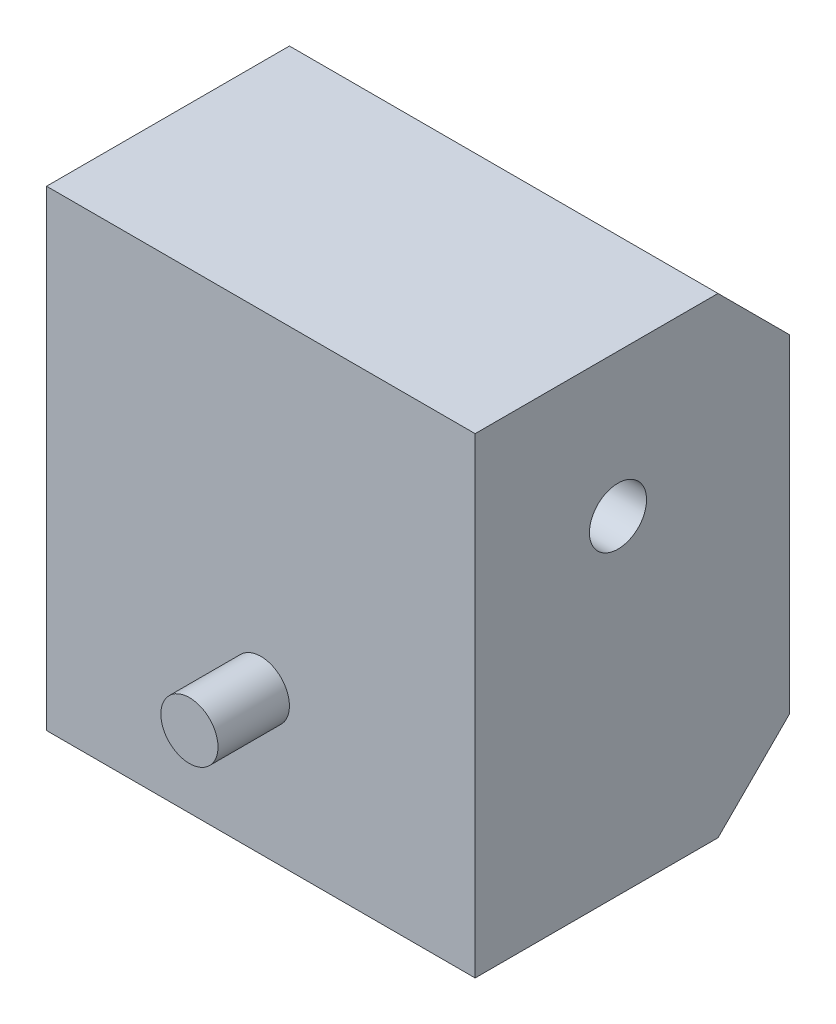
ISO-10303-21;
HEADER;
FILE_DESCRIPTION(('STEP AP214'),'2;1');
FILE_NAME('part.step','',(''),(''),'','','');
FILE_SCHEMA(('AUTOMOTIVE_DESIGN { 1 0 10303 214 1 1 1 1 }'));
ENDSEC;
DATA;
#1=APPLICATION_CONTEXT('core data for automotive mechanical design processes');
#2=APPLICATION_PROTOCOL_DEFINITION('international standard','automotive_design',2000,#1);
#3=PRODUCT_CONTEXT('',#1,'mechanical');
#4=PRODUCT('Part','Part','',(#3));
#5=PRODUCT_RELATED_PRODUCT_CATEGORY('part','',(#4));
#6=PRODUCT_DEFINITION_FORMATION('','',#4);
#7=PRODUCT_DEFINITION_CONTEXT('part definition',#1,'design');
#8=PRODUCT_DEFINITION('design','',#6,#7);
#9=PRODUCT_DEFINITION_SHAPE('','',#8);
#10=(LENGTH_UNIT() NAMED_UNIT(*) SI_UNIT(.MILLI.,.METRE.));
#11=(NAMED_UNIT(*) PLANE_ANGLE_UNIT() SI_UNIT($,.RADIAN.));
#12=(NAMED_UNIT(*) SI_UNIT($,.STERADIAN.) SOLID_ANGLE_UNIT());
#13=UNCERTAINTY_MEASURE_WITH_UNIT(LENGTH_MEASURE(1.E-05),#10,'distance_accuracy_value','');
#14=(GEOMETRIC_REPRESENTATION_CONTEXT(3) GLOBAL_UNCERTAINTY_ASSIGNED_CONTEXT((#13)) GLOBAL_UNIT_ASSIGNED_CONTEXT((#10,
#11,#12)) REPRESENTATION_CONTEXT('',''));
#15=CARTESIAN_POINT('',(0.,0.,0.));
#16=DIRECTION('',(0.,0.,1.));
#17=DIRECTION('',(1.,0.,0.));
#18=AXIS2_PLACEMENT_3D('',#15,#16,#17);
#19=CARTESIAN_POINT('',(-15.1660516605166,12.0664206642066,22.));
#20=DIRECTION('',(1.,0.,0.));
#21=DIRECTION('',(0.,1.,0.));
#22=AXIS2_PLACEMENT_3D('',#19,#20,#21);
#23=PLANE('',#22);
#24=CARTESIAN_POINT('',(-15.1660516605166,2.06642066420664,12.));
#25=DIRECTION('',(1.,0.,0.));
#26=DIRECTION('',(0.,1.,0.));
#27=AXIS2_PLACEMENT_3D('',#24,#25,#26);
#28=CIRCLE('',#27,2.);
#29=CARTESIAN_POINT('',(-15.1660516605166,4.06642066420664,12.));
#30=VERTEX_POINT('',#29);
#31=EDGE_CURVE('E138',#30,#30,#28,.T.);
#32=ORIENTED_EDGE('',*,*,#31,.T.);
#33=EDGE_LOOP('',(#32));
#34=FACE_BOUND('',#33,.T.);
#35=DIRECTION('',(0.,-1.,0.));
#36=VECTOR('',#35,1.);
#37=CARTESIAN_POINT('',(-15.1660516605166,12.0664206642066,0.));
#38=LINE('',#37,#36);
#39=CARTESIAN_POINT('',(-15.1660516605166,7.06642066420662,0.));
#40=VERTEX_POINT('',#39);
#41=CARTESIAN_POINT('',(-15.1660516605166,-15.9335793357933,0.));
#42=VERTEX_POINT('',#41);
#43=EDGE_CURVE('E136',#40,#42,#38,.T.);
#44=ORIENTED_EDGE('',*,*,#43,.T.);
#45=DIRECTION('',(0.,0.707106781186549,-0.707106781186546));
#46=VECTOR('',#45,1.);
#47=CARTESIAN_POINT('',(-15.1660516605166,-20.9335793357934,5.));
#48=LINE('',#47,#46);
#49=CARTESIAN_POINT('',(-15.1660516605166,-20.9335793357934,5.));
#50=VERTEX_POINT('',#49);
#51=EDGE_CURVE('E11',#42,#50,#48,.F.);
#52=ORIENTED_EDGE('',*,*,#51,.T.);
#53=DIRECTION('',(0.,0.,-1.));
#54=VECTOR('',#53,1.);
#55=CARTESIAN_POINT('',(-15.1660516605166,-20.9335793357934,22.));
#56=LINE('',#55,#54);
#57=CARTESIAN_POINT('',(-15.1660516605166,-20.9335793357934,22.));
#58=VERTEX_POINT('',#57);
#59=EDGE_CURVE('E93',#58,#50,#56,.T.);
#60=ORIENTED_EDGE('',*,*,#59,.F.);
#61=DIRECTION('',(0.,-1.,0.));
#62=VECTOR('',#61,1.);
#63=CARTESIAN_POINT('',(-15.1660516605166,12.0664206642066,22.));
#64=LINE('',#63,#62);
#65=CARTESIAN_POINT('',(-15.1660516605166,12.0664206642066,22.));
#66=VERTEX_POINT('',#65);
#67=EDGE_CURVE('E99',#66,#58,#64,.T.);
#68=ORIENTED_EDGE('',*,*,#67,.F.);
#69=DIRECTION('',(0.,0.,-1.));
#70=VECTOR('',#69,1.);
#71=CARTESIAN_POINT('',(-15.1660516605166,12.0664206642066,22.));
#72=LINE('',#71,#70);
#73=CARTESIAN_POINT('',(-15.1660516605166,12.0664206642066,5.));
#74=VERTEX_POINT('',#73);
#75=EDGE_CURVE('E133',#66,#74,#72,.T.);
#76=ORIENTED_EDGE('',*,*,#75,.T.);
#77=DIRECTION('',(0.,0.707106781186549,0.707106781186546));
#78=VECTOR('',#77,1.);
#79=CARTESIAN_POINT('',(-15.1660516605166,12.0664206642066,5.));
#80=LINE('',#79,#78);
#81=EDGE_CURVE('E114',#74,#40,#80,.F.);
#82=ORIENTED_EDGE('',*,*,#81,.T.);
#83=EDGE_LOOP('',(#44,#52,#60,#68,#76,#82));
#84=FACE_BOUND('',#83,.T.);
#85=ADVANCED_FACE('F35',(#34,#84),#23,.F.);
#86=CARTESIAN_POINT('',(-15.1660516605166,-20.9335793357934,22.));
#87=DIRECTION('',(0.,1.,0.));
#88=DIRECTION('',(0.,0.,1.));
#89=AXIS2_PLACEMENT_3D('',#86,#87,#88);
#90=PLANE('',#89);
#91=ORIENTED_EDGE('',*,*,#59,.T.);
#92=DIRECTION('',(1.,0.,0.));
#93=VECTOR('',#92,1.);
#94=CARTESIAN_POINT('',(-15.1660516605166,-20.9335793357934,5.));
#95=LINE('',#94,#93);
#96=CARTESIAN_POINT('',(14.8339483394834,-20.9335793357934,5.));
#97=VERTEX_POINT('',#96);
#98=EDGE_CURVE('E126',#50,#97,#95,.T.);
#99=ORIENTED_EDGE('',*,*,#98,.T.);
#100=DIRECTION('',(0.,0.,-1.));
#101=VECTOR('',#100,1.);
#102=CARTESIAN_POINT('',(14.8339483394834,-20.9335793357934,22.));
#103=LINE('',#102,#101);
#104=CARTESIAN_POINT('',(14.8339483394834,-20.9335793357934,22.));
#105=VERTEX_POINT('',#104);
#106=EDGE_CURVE('E95',#105,#97,#103,.T.);
#107=ORIENTED_EDGE('',*,*,#106,.F.);
#108=DIRECTION('',(1.,0.,0.));
#109=VECTOR('',#108,1.);
#110=CARTESIAN_POINT('',(-15.1660516605166,-20.9335793357934,22.));
#111=LINE('',#110,#109);
#112=EDGE_CURVE('E88',#58,#105,#111,.T.);
#113=ORIENTED_EDGE('',*,*,#112,.F.);
#114=EDGE_LOOP('',(#91,#99,#107,#113));
#115=FACE_BOUND('',#114,.T.);
#116=ADVANCED_FACE('F90',(#115),#90,.F.);
#117=CARTESIAN_POINT('',(14.8339483394834,12.0664206642066,22.));
#118=DIRECTION('',(-1.,0.,0.));
#119=DIRECTION('',(0.,-1.,0.));
#120=AXIS2_PLACEMENT_3D('',#117,#118,#119);
#121=PLANE('',#120);
#122=CARTESIAN_POINT('',(14.8339483394834,2.06642066420665,12.));
#123=DIRECTION('',(1.,0.,0.));
#124=DIRECTION('',(0.,1.,0.));
#125=AXIS2_PLACEMENT_3D('',#122,#123,#124);
#126=CIRCLE('',#125,2.);
#127=CARTESIAN_POINT('',(14.8339483394834,4.06642066420665,12.));
#128=VERTEX_POINT('',#127);
#129=EDGE_CURVE('E192',#128,#128,#126,.T.);
#130=ORIENTED_EDGE('',*,*,#129,.F.);
#131=EDGE_LOOP('',(#130));
#132=FACE_BOUND('',#131,.T.);
#133=ORIENTED_EDGE('',*,*,#106,.T.);
#134=DIRECTION('',(0.,-0.707106781186549,0.707106781186546));
#135=VECTOR('',#134,1.);
#136=CARTESIAN_POINT('',(14.8339483394834,-20.9335793357934,5.));
#137=LINE('',#136,#135);
#138=CARTESIAN_POINT('',(14.8339483394834,-15.9335793357933,0.));
#139=VERTEX_POINT('',#138);
#140=EDGE_CURVE('E58',#97,#139,#137,.F.);
#141=ORIENTED_EDGE('',*,*,#140,.T.);
#142=DIRECTION('',(0.,1.,0.));
#143=VECTOR('',#142,1.);
#144=CARTESIAN_POINT('',(14.8339483394834,12.0664206642066,0.));
#145=LINE('',#144,#143);
#146=CARTESIAN_POINT('',(14.8339483394834,7.06642066420662,0.));
#147=VERTEX_POINT('',#146);
#148=EDGE_CURVE('E108',#139,#147,#145,.T.);
#149=ORIENTED_EDGE('',*,*,#148,.T.);
#150=DIRECTION('',(0.,-0.707106781186549,-0.707106781186546));
#151=VECTOR('',#150,1.);
#152=CARTESIAN_POINT('',(14.8339483394834,12.0664206642066,5.));
#153=LINE('',#152,#151);
#154=CARTESIAN_POINT('',(14.8339483394834,12.0664206642066,5.));
#155=VERTEX_POINT('',#154);
#156=EDGE_CURVE('E124',#147,#155,#153,.F.);
#157=ORIENTED_EDGE('',*,*,#156,.T.);
#158=DIRECTION('',(0.,0.,-1.));
#159=VECTOR('',#158,1.);
#160=CARTESIAN_POINT('',(14.8339483394834,12.0664206642066,22.));
#161=LINE('',#160,#159);
#162=CARTESIAN_POINT('',(14.8339483394834,12.0664206642066,22.));
#163=VERTEX_POINT('',#162);
#164=EDGE_CURVE('E116',#163,#155,#161,.T.);
#165=ORIENTED_EDGE('',*,*,#164,.F.);
#166=DIRECTION('',(0.,1.,0.));
#167=VECTOR('',#166,1.);
#168=CARTESIAN_POINT('',(14.8339483394834,12.0664206642066,22.));
#169=LINE('',#168,#167);
#170=EDGE_CURVE('E98',#105,#163,#169,.T.);
#171=ORIENTED_EDGE('',*,*,#170,.F.);
#172=EDGE_LOOP('',(#133,#141,#149,#157,#165,#171));
#173=FACE_BOUND('',#172,.T.);
#174=ADVANCED_FACE('F129',(#132,#173),#121,.F.);
#175=CARTESIAN_POINT('',(-15.1660516605166,12.0664206642066,22.));
#176=DIRECTION('',(0.,-1.,0.));
#177=DIRECTION('',(0.,0.,-1.));
#178=AXIS2_PLACEMENT_3D('',#175,#176,#177);
#179=PLANE('',#178);
#180=ORIENTED_EDGE('',*,*,#164,.T.);
#181=DIRECTION('',(-1.,0.,0.));
#182=VECTOR('',#181,1.);
#183=CARTESIAN_POINT('',(-15.1660516605166,12.0664206642066,5.));
#184=LINE('',#183,#182);
#185=EDGE_CURVE('E111',#155,#74,#184,.T.);
#186=ORIENTED_EDGE('',*,*,#185,.T.);
#187=ORIENTED_EDGE('',*,*,#75,.F.);
#188=DIRECTION('',(-1.,0.,0.));
#189=VECTOR('',#188,1.);
#190=CARTESIAN_POINT('',(-15.1660516605166,12.0664206642066,22.));
#191=LINE('',#190,#189);
#192=EDGE_CURVE('E104',#163,#66,#191,.T.);
#193=ORIENTED_EDGE('',*,*,#192,.F.);
#194=EDGE_LOOP('',(#180,#186,#187,#193));
#195=FACE_BOUND('',#194,.T.);
#196=ADVANCED_FACE('F142',(#195),#179,.F.);
#197=CARTESIAN_POINT('',(0.,0.,22.));
#198=DIRECTION('',(0.,0.,1.));
#199=DIRECTION('',(1.,0.,0.));
#200=AXIS2_PLACEMENT_3D('',#197,#198,#199);
#201=PLANE('',#200);
#202=CARTESIAN_POINT('',(-0.166051660516602,-10.9335793357934,22.));
#203=DIRECTION('',(0.,0.,1.));
#204=DIRECTION('',(1.,0.,0.));
#205=AXIS2_PLACEMENT_3D('',#202,#203,#204);
#206=CIRCLE('',#205,2.);
#207=CARTESIAN_POINT('',(1.8339483394834,-10.9335793357934,22.));
#208=VERTEX_POINT('',#207);
#209=EDGE_CURVE('E193',#208,#208,#206,.T.);
#210=ORIENTED_EDGE('',*,*,#209,.F.);
#211=EDGE_LOOP('',(#210));
#212=FACE_BOUND('',#211,.T.);
#213=ORIENTED_EDGE('',*,*,#67,.T.);
#214=ORIENTED_EDGE('',*,*,#112,.T.);
#215=ORIENTED_EDGE('',*,*,#170,.T.);
#216=ORIENTED_EDGE('',*,*,#192,.T.);
#217=EDGE_LOOP('',(#213,#214,#215,#216));
#218=FACE_BOUND('',#217,.T.);
#219=ADVANCED_FACE('F102',(#212,#218),#201,.T.);
#220=CARTESIAN_POINT('',(0.,0.,0.));
#221=DIRECTION('',(0.,0.,1.));
#222=DIRECTION('',(1.,0.,0.));
#223=AXIS2_PLACEMENT_3D('',#220,#221,#222);
#224=PLANE('',#223);
#225=ORIENTED_EDGE('',*,*,#148,.F.);
#226=DIRECTION('',(-1.,0.,0.));
#227=VECTOR('',#226,1.);
#228=CARTESIAN_POINT('',(0.,-15.9335793357933,0.));
#229=LINE('',#228,#227);
#230=EDGE_CURVE('E44',#139,#42,#229,.T.);
#231=ORIENTED_EDGE('',*,*,#230,.T.);
#232=ORIENTED_EDGE('',*,*,#43,.F.);
#233=DIRECTION('',(1.,0.,0.));
#234=VECTOR('',#233,1.);
#235=CARTESIAN_POINT('',(0.,7.06642066420662,0.));
#236=LINE('',#235,#234);
#237=EDGE_CURVE('E121',#40,#147,#236,.T.);
#238=ORIENTED_EDGE('',*,*,#237,.T.);
#239=EDGE_LOOP('',(#225,#231,#232,#238));
#240=FACE_BOUND('',#239,.T.);
#241=ADVANCED_FACE('F147',(#240),#224,.F.);
#242=CARTESIAN_POINT('',(-15.1660516605166,12.0664206642066,5.));
#243=DIRECTION('',(0.,-0.707106781186546,0.707106781186549));
#244=DIRECTION('',(-1.,0.,0.));
#245=AXIS2_PLACEMENT_3D('',#242,#243,#244);
#246=PLANE('',#245);
#247=ORIENTED_EDGE('',*,*,#156,.F.);
#248=ORIENTED_EDGE('',*,*,#237,.F.);
#249=ORIENTED_EDGE('',*,*,#81,.F.);
#250=ORIENTED_EDGE('',*,*,#185,.F.);
#251=EDGE_LOOP('',(#247,#248,#249,#250));
#252=FACE_BOUND('',#251,.T.);
#253=ADVANCED_FACE('F145',(#252),#246,.F.);
#254=CARTESIAN_POINT('',(-15.1660516605166,-20.9335793357934,5.));
#255=DIRECTION('',(0.,0.707106781186546,0.707106781186549));
#256=DIRECTION('',(1.,0.,0.));
#257=AXIS2_PLACEMENT_3D('',#254,#255,#256);
#258=PLANE('',#257);
#259=ORIENTED_EDGE('',*,*,#51,.F.);
#260=ORIENTED_EDGE('',*,*,#230,.F.);
#261=ORIENTED_EDGE('',*,*,#140,.F.);
#262=ORIENTED_EDGE('',*,*,#98,.F.);
#263=EDGE_LOOP('',(#259,#260,#261,#262));
#264=FACE_BOUND('',#263,.T.);
#265=ADVANCED_FACE('F38',(#264),#258,.F.);
#266=CARTESIAN_POINT('',(-20.1660516605166,2.06642066420664,12.));
#267=DIRECTION('',(1.,0.,0.));
#268=DIRECTION('',(0.,1.,0.));
#269=AXIS2_PLACEMENT_3D('',#266,#267,#268);
#270=CYLINDRICAL_SURFACE('',#269,2.);
#271=ORIENTED_EDGE('',*,*,#129,.T.);
#272=EDGE_LOOP('',(#271));
#273=FACE_BOUND('',#272,.T.);
#274=ORIENTED_EDGE('',*,*,#31,.F.);
#275=EDGE_LOOP('',(#274));
#276=FACE_BOUND('',#275,.T.);
#277=ADVANCED_FACE('F149',(#273,#276),#270,.F.);
#278=CARTESIAN_POINT('',(-0.166051660516602,-10.9335793357934,27.));
#279=DIRECTION('',(0.,0.,-1.));
#280=DIRECTION('',(-1.,0.,0.));
#281=AXIS2_PLACEMENT_3D('',#278,#279,#280);
#282=CYLINDRICAL_SURFACE('',#281,2.);
#283=CARTESIAN_POINT('',(-0.166051660516602,-10.9335793357934,27.));
#284=DIRECTION('',(0.,0.,1.));
#285=DIRECTION('',(1.,0.,0.));
#286=AXIS2_PLACEMENT_3D('',#283,#284,#285);
#287=CIRCLE('',#286,2.);
#288=CARTESIAN_POINT('',(1.8339483394834,-10.9335793357934,27.));
#289=VERTEX_POINT('',#288);
#290=EDGE_CURVE('E191',#289,#289,#287,.T.);
#291=ORIENTED_EDGE('',*,*,#290,.F.);
#292=EDGE_LOOP('',(#291));
#293=FACE_BOUND('',#292,.T.);
#294=ORIENTED_EDGE('',*,*,#209,.T.);
#295=EDGE_LOOP('',(#294));
#296=FACE_BOUND('',#295,.T.);
#297=ADVANCED_FACE('F154',(#293,#296),#282,.T.);
#298=CARTESIAN_POINT('',(-0.166051660516602,-10.9335793357934,27.));
#299=DIRECTION('',(0.,0.,1.));
#300=DIRECTION('',(1.,0.,0.));
#301=AXIS2_PLACEMENT_3D('',#298,#299,#300);
#302=PLANE('',#301);
#303=ORIENTED_EDGE('',*,*,#290,.T.);
#304=EDGE_LOOP('',(#303));
#305=FACE_BOUND('',#304,.T.);
#306=ADVANCED_FACE('F183',(#305),#302,.T.);
#307=CLOSED_SHELL('',(#85,#116,#174,#196,#219,#241,#253,#265,#277,#297,#306));
#308=MANIFOLD_SOLID_BREP('B2',#307);
#309=ADVANCED_BREP_SHAPE_REPRESENTATION('',(#18,#308),#14);
#310=SHAPE_DEFINITION_REPRESENTATION(#9,#309);
ENDSEC;
END-ISO-10303-21;
